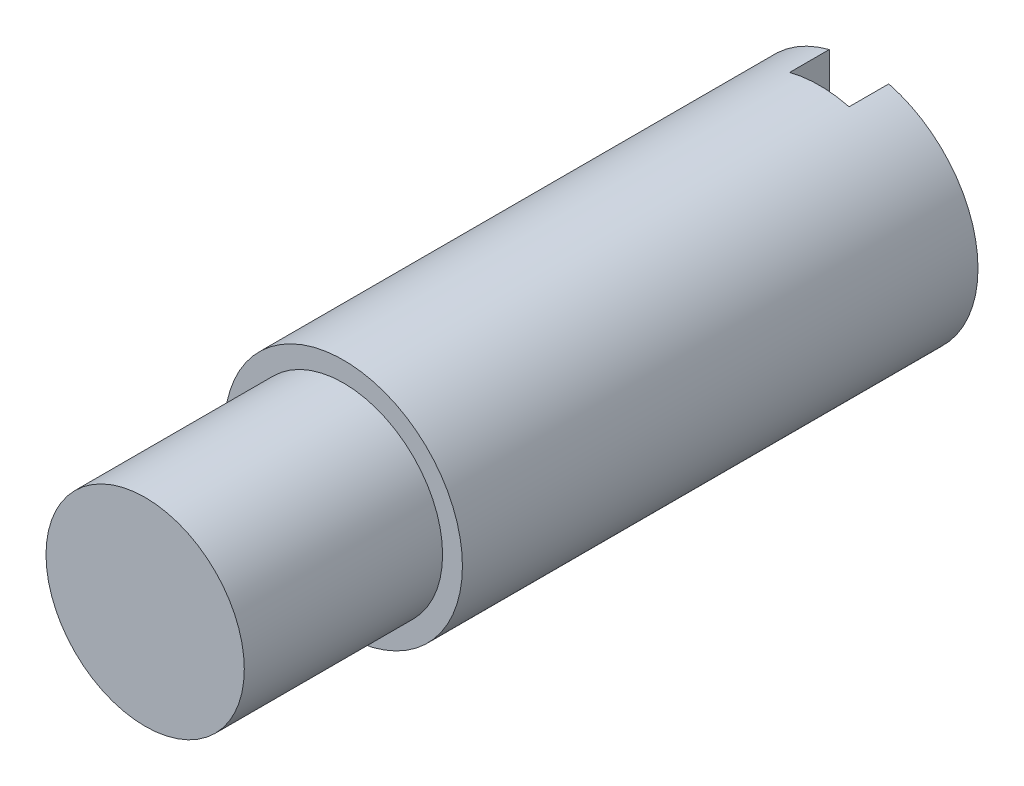
ISO-10303-21;
HEADER;
FILE_DESCRIPTION(('STEP AP214'),'2;1');
FILE_NAME('part.step','',(''),(''),'','','');
FILE_SCHEMA(('AUTOMOTIVE_DESIGN { 1 0 10303 214 1 1 1 1 }'));
ENDSEC;
DATA;
#1=APPLICATION_CONTEXT('core data for automotive mechanical design processes');
#2=APPLICATION_PROTOCOL_DEFINITION('international standard','automotive_design',2000,#1);
#3=PRODUCT_CONTEXT('',#1,'mechanical');
#4=PRODUCT('Part','Part','',(#3));
#5=PRODUCT_RELATED_PRODUCT_CATEGORY('part','',(#4));
#6=PRODUCT_DEFINITION_FORMATION('','',#4);
#7=PRODUCT_DEFINITION_CONTEXT('part definition',#1,'design');
#8=PRODUCT_DEFINITION('design','',#6,#7);
#9=PRODUCT_DEFINITION_SHAPE('','',#8);
#10=(LENGTH_UNIT() NAMED_UNIT(*) SI_UNIT(.MILLI.,.METRE.));
#11=(NAMED_UNIT(*) PLANE_ANGLE_UNIT() SI_UNIT($,.RADIAN.));
#12=(NAMED_UNIT(*) SI_UNIT($,.STERADIAN.) SOLID_ANGLE_UNIT());
#13=UNCERTAINTY_MEASURE_WITH_UNIT(LENGTH_MEASURE(1.E-05),#10,'distance_accuracy_value','');
#14=(GEOMETRIC_REPRESENTATION_CONTEXT(3) GLOBAL_UNCERTAINTY_ASSIGNED_CONTEXT((#13)) GLOBAL_UNIT_ASSIGNED_CONTEXT((#10,
#11,#12)) REPRESENTATION_CONTEXT('',''));
#15=CARTESIAN_POINT('',(0.,0.,0.));
#16=DIRECTION('',(0.,0.,1.));
#17=DIRECTION('',(1.,0.,0.));
#18=AXIS2_PLACEMENT_3D('',#15,#16,#17);
#19=CARTESIAN_POINT('',(0.,0.,0.));
#20=DIRECTION('',(0.,0.,1.));
#21=DIRECTION('',(1.,0.,0.));
#22=AXIS2_PLACEMENT_3D('',#19,#20,#21);
#23=PLANE('',#22);
#24=CARTESIAN_POINT('',(0.,0.,0.));
#25=DIRECTION('',(0.,0.,1.));
#26=DIRECTION('',(1.,0.,0.));
#27=AXIS2_PLACEMENT_3D('',#24,#25,#26);
#28=CIRCLE('',#27,3.);
#29=CARTESIAN_POINT('',(0.75,-2.90473750965556,0.));
#30=VERTEX_POINT('',#29);
#31=CARTESIAN_POINT('',(0.75,2.90473750965556,0.));
#32=VERTEX_POINT('',#31);
#33=EDGE_CURVE('E95',#30,#32,#28,.T.);
#34=ORIENTED_EDGE('',*,*,#33,.F.);
#35=DIRECTION('',(0.,1.,0.));
#36=VECTOR('',#35,1.);
#37=CARTESIAN_POINT('',(0.75,0.,0.));
#38=LINE('',#37,#36);
#39=EDGE_CURVE('E82',#30,#32,#38,.T.);
#40=ORIENTED_EDGE('',*,*,#39,.T.);
#41=EDGE_LOOP('',(#34,#40));
#42=FACE_BOUND('',#41,.T.);
#43=ADVANCED_FACE('F35',(#42),#23,.F.);
#44=CARTESIAN_POINT('',(0.,0.,13.));
#45=DIRECTION('',(0.,0.,-1.));
#46=DIRECTION('',(-1.,0.,0.));
#47=AXIS2_PLACEMENT_3D('',#44,#45,#46);
#48=CYLINDRICAL_SURFACE('',#47,3.);
#49=ORIENTED_EDGE('',*,*,#33,.T.);
#50=DIRECTION('',(0.,0.,-1.));
#51=VECTOR('',#50,1.);
#52=CARTESIAN_POINT('',(0.75,2.90473750965556,13.));
#53=LINE('',#52,#51);
#54=CARTESIAN_POINT('',(0.75,2.90473750965556,0.999999999999999));
#55=VERTEX_POINT('',#54);
#56=EDGE_CURVE('E91',#32,#55,#53,.F.);
#57=ORIENTED_EDGE('',*,*,#56,.T.);
#58=CARTESIAN_POINT('',(0.,0.,0.999999999999999));
#59=DIRECTION('',(0.,0.,-1.));
#60=DIRECTION('',(-1.,0.,0.));
#61=AXIS2_PLACEMENT_3D('',#58,#59,#60);
#62=CIRCLE('',#61,3.);
#63=CARTESIAN_POINT('',(-0.75,2.90473750965556,0.999999999999999));
#64=VERTEX_POINT('',#63);
#65=EDGE_CURVE('E11',#64,#55,#62,.T.);
#66=ORIENTED_EDGE('',*,*,#65,.F.);
#67=DIRECTION('',(0.,0.,-1.));
#68=VECTOR('',#67,1.);
#69=CARTESIAN_POINT('',(-0.75,2.90473750965556,13.));
#70=LINE('',#69,#68);
#71=CARTESIAN_POINT('',(-0.75,2.90473750965556,0.));
#72=VERTEX_POINT('',#71);
#73=EDGE_CURVE('E77',#64,#72,#70,.T.);
#74=ORIENTED_EDGE('',*,*,#73,.T.);
#75=CARTESIAN_POINT('',(-0.75,-2.90473750965556,0.));
#76=VERTEX_POINT('',#75);
#77=EDGE_CURVE('E89',#72,#76,#28,.T.);
#78=ORIENTED_EDGE('',*,*,#77,.T.);
#79=DIRECTION('',(0.,0.,-1.));
#80=VECTOR('',#79,1.);
#81=CARTESIAN_POINT('',(-0.75,-2.90473750965556,13.));
#82=LINE('',#81,#80);
#83=CARTESIAN_POINT('',(-0.75,-2.90473750965556,0.999999999999999));
#84=VERTEX_POINT('',#83);
#85=EDGE_CURVE('E50',#76,#84,#82,.F.);
#86=ORIENTED_EDGE('',*,*,#85,.T.);
#87=CARTESIAN_POINT('',(0.75,-2.90473750965556,0.999999999999999));
#88=VERTEX_POINT('',#87);
#89=EDGE_CURVE('E39',#88,#84,#62,.T.);
#90=ORIENTED_EDGE('',*,*,#89,.F.);
#91=DIRECTION('',(0.,0.,-1.));
#92=VECTOR('',#91,1.);
#93=CARTESIAN_POINT('',(0.75,-2.90473750965556,13.));
#94=LINE('',#93,#92);
#95=EDGE_CURVE('E58',#88,#30,#94,.T.);
#96=ORIENTED_EDGE('',*,*,#95,.T.);
#97=EDGE_LOOP('',(#49,#57,#66,#74,#78,#86,#90,#96));
#98=FACE_BOUND('',#97,.T.);
#99=CARTESIAN_POINT('',(0.,0.,13.));
#100=DIRECTION('',(0.,0.,1.));
#101=DIRECTION('',(1.,0.,0.));
#102=AXIS2_PLACEMENT_3D('',#99,#100,#101);
#103=CIRCLE('',#102,3.);
#104=CARTESIAN_POINT('',(3.,0.,13.));
#105=VERTEX_POINT('',#104);
#106=EDGE_CURVE('E94',#105,#105,#103,.T.);
#107=ORIENTED_EDGE('',*,*,#106,.F.);
#108=EDGE_LOOP('',(#107));
#109=FACE_BOUND('',#108,.T.);
#110=ADVANCED_FACE('F37',(#98,#109),#48,.T.);
#111=CARTESIAN_POINT('',(0.,0.,13.));
#112=DIRECTION('',(0.,0.,1.));
#113=DIRECTION('',(1.,0.,0.));
#114=AXIS2_PLACEMENT_3D('',#111,#112,#113);
#115=PLANE('',#114);
#116=CARTESIAN_POINT('',(0.,0.,13.));
#117=DIRECTION('',(0.,0.,1.));
#118=DIRECTION('',(1.,0.,0.));
#119=AXIS2_PLACEMENT_3D('',#116,#117,#118);
#120=CIRCLE('',#119,2.5);
#121=CARTESIAN_POINT('',(2.5,0.,13.));
#122=VERTEX_POINT('',#121);
#123=EDGE_CURVE('E83',#122,#122,#120,.T.);
#124=ORIENTED_EDGE('',*,*,#123,.F.);
#125=EDGE_LOOP('',(#124));
#126=FACE_BOUND('',#125,.T.);
#127=ORIENTED_EDGE('',*,*,#106,.T.);
#128=EDGE_LOOP('',(#127));
#129=FACE_BOUND('',#128,.T.);
#130=ADVANCED_FACE('F121',(#126,#129),#115,.T.);
#131=ORIENTED_EDGE('',*,*,#77,.F.);
#132=DIRECTION('',(0.,-1.,0.));
#133=VECTOR('',#132,1.);
#134=CARTESIAN_POINT('',(-0.75,0.,0.));
#135=LINE('',#134,#133);
#136=EDGE_CURVE('E74',#72,#76,#135,.T.);
#137=ORIENTED_EDGE('',*,*,#136,.T.);
#138=EDGE_LOOP('',(#131,#137));
#139=FACE_BOUND('',#138,.T.);
#140=ADVANCED_FACE('F93',(#139),#23,.F.);
#141=CARTESIAN_POINT('',(0.,0.,18.));
#142=DIRECTION('',(0.,0.,-1.));
#143=DIRECTION('',(-1.,0.,0.));
#144=AXIS2_PLACEMENT_3D('',#141,#142,#143);
#145=CYLINDRICAL_SURFACE('',#144,2.5);
#146=CARTESIAN_POINT('',(0.,0.,18.));
#147=DIRECTION('',(0.,0.,1.));
#148=DIRECTION('',(1.,0.,0.));
#149=AXIS2_PLACEMENT_3D('',#146,#147,#148);
#150=CIRCLE('',#149,2.5);
#151=CARTESIAN_POINT('',(2.5,0.,18.));
#152=VERTEX_POINT('',#151);
#153=EDGE_CURVE('E99',#152,#152,#150,.T.);
#154=ORIENTED_EDGE('',*,*,#153,.F.);
#155=EDGE_LOOP('',(#154));
#156=FACE_BOUND('',#155,.T.);
#157=ORIENTED_EDGE('',*,*,#123,.T.);
#158=EDGE_LOOP('',(#157));
#159=FACE_BOUND('',#158,.T.);
#160=ADVANCED_FACE('F119',(#156,#159),#145,.T.);
#161=CARTESIAN_POINT('',(0.,0.,18.));
#162=DIRECTION('',(0.,0.,1.));
#163=DIRECTION('',(1.,0.,0.));
#164=AXIS2_PLACEMENT_3D('',#161,#162,#163);
#165=PLANE('',#164);
#166=ORIENTED_EDGE('',*,*,#153,.T.);
#167=EDGE_LOOP('',(#166));
#168=FACE_BOUND('',#167,.T.);
#169=ADVANCED_FACE('F136',(#168),#165,.T.);
#170=CARTESIAN_POINT('',(0.,0.,1.));
#171=DIRECTION('',(0.,0.,-1.));
#172=DIRECTION('',(-1.,0.,0.));
#173=AXIS2_PLACEMENT_3D('',#170,#171,#172);
#174=PLANE('',#173);
#175=ORIENTED_EDGE('',*,*,#65,.T.);
#176=DIRECTION('',(0.,-1.,0.));
#177=VECTOR('',#176,1.);
#178=CARTESIAN_POINT('',(0.75,3.6128699654776,1.));
#179=LINE('',#178,#177);
#180=EDGE_CURVE('E108',#55,#88,#179,.T.);
#181=ORIENTED_EDGE('',*,*,#180,.T.);
#182=ORIENTED_EDGE('',*,*,#89,.T.);
#183=DIRECTION('',(0.,1.,0.));
#184=VECTOR('',#183,1.);
#185=CARTESIAN_POINT('',(-0.75,3.6128699654776,1.));
#186=LINE('',#185,#184);
#187=EDGE_CURVE('E107',#84,#64,#186,.T.);
#188=ORIENTED_EDGE('',*,*,#187,.T.);
#189=EDGE_LOOP('',(#175,#181,#182,#188));
#190=FACE_BOUND('',#189,.T.);
#191=ADVANCED_FACE('F106',(#190),#174,.T.);
#192=CARTESIAN_POINT('',(0.75,3.6128699654776,1.));
#193=DIRECTION('',(1.,0.,0.));
#194=DIRECTION('',(0.,1.,0.));
#195=AXIS2_PLACEMENT_3D('',#192,#193,#194);
#196=PLANE('',#195);
#197=ORIENTED_EDGE('',*,*,#180,.F.);
#198=ORIENTED_EDGE('',*,*,#56,.F.);
#199=ORIENTED_EDGE('',*,*,#39,.F.);
#200=ORIENTED_EDGE('',*,*,#95,.F.);
#201=EDGE_LOOP('',(#197,#198,#199,#200));
#202=FACE_BOUND('',#201,.T.);
#203=ADVANCED_FACE('F146',(#202),#196,.F.);
#204=CARTESIAN_POINT('',(-0.75,3.6128699654776,1.));
#205=DIRECTION('',(-1.,0.,0.));
#206=DIRECTION('',(0.,-1.,0.));
#207=AXIS2_PLACEMENT_3D('',#204,#205,#206);
#208=PLANE('',#207);
#209=ORIENTED_EDGE('',*,*,#187,.F.);
#210=ORIENTED_EDGE('',*,*,#85,.F.);
#211=ORIENTED_EDGE('',*,*,#136,.F.);
#212=ORIENTED_EDGE('',*,*,#73,.F.);
#213=EDGE_LOOP('',(#209,#210,#211,#212));
#214=FACE_BOUND('',#213,.T.);
#215=ADVANCED_FACE('F76',(#214),#208,.F.);
#216=CLOSED_SHELL('',(#43,#110,#130,#140,#160,#169,#191,#203,#215));
#217=MANIFOLD_SOLID_BREP('B2',#216);
#218=ADVANCED_BREP_SHAPE_REPRESENTATION('',(#18,#217),#14);
#219=SHAPE_DEFINITION_REPRESENTATION(#9,#218);
ENDSEC;
END-ISO-10303-21;
